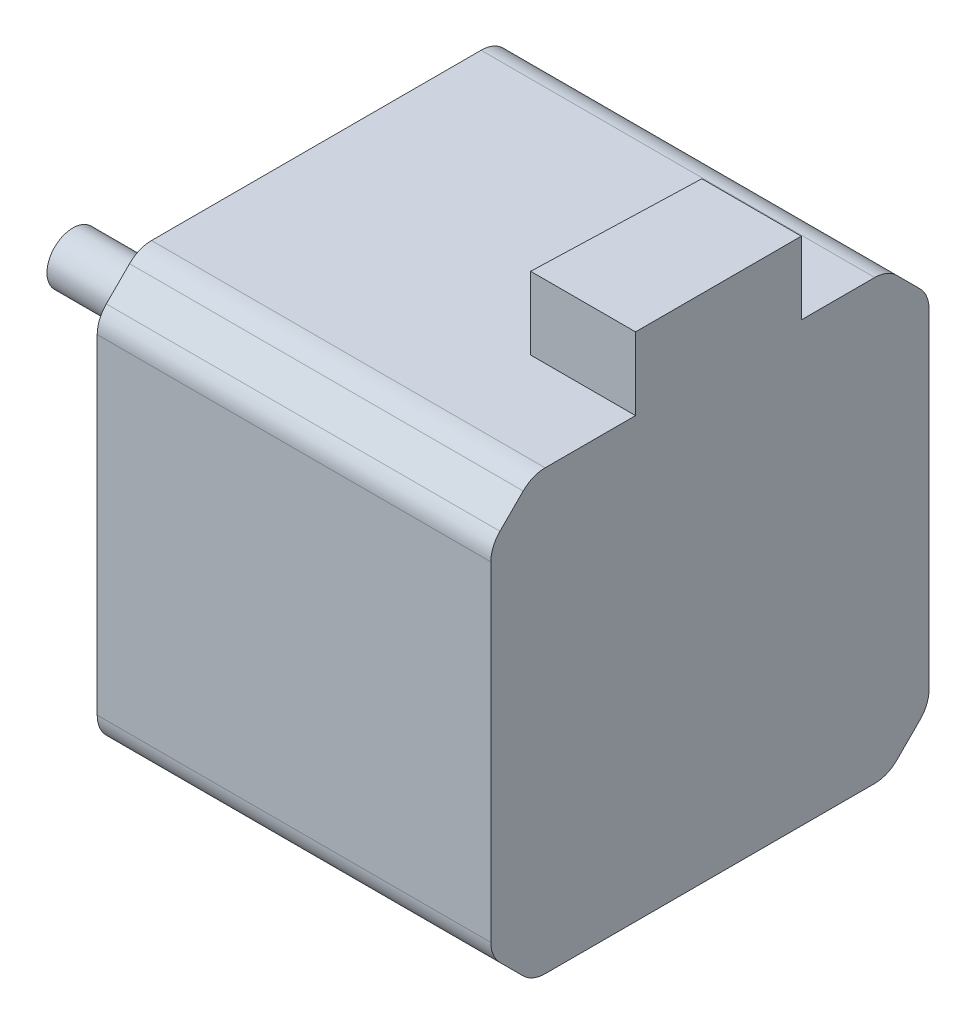
ISO-10303-21;
HEADER;
FILE_DESCRIPTION(('STEP AP214'),'2;1');
FILE_NAME('part.step','',(''),(''),'','','');
FILE_SCHEMA(('AUTOMOTIVE_DESIGN { 1 0 10303 214 1 1 1 1 }'));
ENDSEC;
DATA;
#1=APPLICATION_CONTEXT('core data for automotive mechanical design processes');
#2=APPLICATION_PROTOCOL_DEFINITION('international standard','automotive_design',2000,#1);
#3=PRODUCT_CONTEXT('',#1,'mechanical');
#4=PRODUCT('Part','Part','',(#3));
#5=PRODUCT_RELATED_PRODUCT_CATEGORY('part','',(#4));
#6=PRODUCT_DEFINITION_FORMATION('','',#4);
#7=PRODUCT_DEFINITION_CONTEXT('part definition',#1,'design');
#8=PRODUCT_DEFINITION('design','',#6,#7);
#9=PRODUCT_DEFINITION_SHAPE('','',#8);
#10=(LENGTH_UNIT() NAMED_UNIT(*) SI_UNIT(.MILLI.,.METRE.));
#11=(NAMED_UNIT(*) PLANE_ANGLE_UNIT() SI_UNIT($,.RADIAN.));
#12=(NAMED_UNIT(*) SI_UNIT($,.STERADIAN.) SOLID_ANGLE_UNIT());
#13=UNCERTAINTY_MEASURE_WITH_UNIT(LENGTH_MEASURE(1.E-05),#10,'distance_accuracy_value','');
#14=(GEOMETRIC_REPRESENTATION_CONTEXT(3) GLOBAL_UNCERTAINTY_ASSIGNED_CONTEXT((#13)) GLOBAL_UNIT_ASSIGNED_CONTEXT((#10,
#11,#12)) REPRESENTATION_CONTEXT('',''));
#15=CARTESIAN_POINT('',(0.,0.,0.));
#16=DIRECTION('',(0.,0.,1.));
#17=DIRECTION('',(1.,0.,0.));
#18=AXIS2_PLACEMENT_3D('',#15,#16,#17);
#19=CARTESIAN_POINT('',(38.,42.3,-5.2426406871193));
#20=DIRECTION('',(0.,1.,0.));
#21=DIRECTION('',(0.,0.,1.));
#22=AXIS2_PLACEMENT_3D('',#19,#20,#21);
#23=PLANE('',#22);
#24=DIRECTION('',(-0.032942464499696,0.,0.999457249727414));
#25=VECTOR('',#24,1.);
#26=CARTESIAN_POINT('',(28.4,42.3,-29.967521896495));
#27=LINE('',#26,#25);
#28=CARTESIAN_POINT('',(28.4,42.3,-29.967521896495));
#29=VERTEX_POINT('',#28);
#30=CARTESIAN_POINT('',(27.8726343401492,42.3,-13.967521896495));
#31=VERTEX_POINT('',#30);
#32=EDGE_CURVE('E49',#29,#31,#27,.T.);
#33=ORIENTED_EDGE('',*,*,#32,.F.);
#34=DIRECTION('',(-1.,0.,0.));
#35=VECTOR('',#34,1.);
#36=CARTESIAN_POINT('',(28.4,42.3,-29.967521896495));
#37=LINE('',#36,#35);
#38=CARTESIAN_POINT('',(38.,42.3,-29.967521896495));
#39=VERTEX_POINT('',#38);
#40=EDGE_CURVE('E706',#39,#29,#37,.T.);
#41=ORIENTED_EDGE('',*,*,#40,.F.);
#42=DIRECTION('',(0.,0.,-1.));
#43=VECTOR('',#42,1.);
#44=CARTESIAN_POINT('',(38.,42.3,-5.2426406871193));
#45=LINE('',#44,#43);
#46=CARTESIAN_POINT('',(38.,42.3,-37.0573593128807));
#47=VERTEX_POINT('',#46);
#48=EDGE_CURVE('E193',#39,#47,#45,.T.);
#49=ORIENTED_EDGE('',*,*,#48,.T.);
#50=DIRECTION('',(-1.,0.,0.));
#51=VECTOR('',#50,1.);
#52=CARTESIAN_POINT('',(38.,42.3,-37.0573593128807));
#53=LINE('',#52,#51);
#54=CARTESIAN_POINT('',(0.,42.3,-37.0573593128807));
#55=VERTEX_POINT('',#54);
#56=EDGE_CURVE('E348',#47,#55,#53,.T.);
#57=ORIENTED_EDGE('',*,*,#56,.T.);
#58=DIRECTION('',(0.,0.,-1.));
#59=VECTOR('',#58,1.);
#60=CARTESIAN_POINT('',(0.,42.3,-5.2426406871193));
#61=LINE('',#60,#59);
#62=CARTESIAN_POINT('',(0.,42.3,-5.2426406871193));
#63=VERTEX_POINT('',#62);
#64=EDGE_CURVE('E276',#63,#55,#61,.T.);
#65=ORIENTED_EDGE('',*,*,#64,.F.);
#66=DIRECTION('',(-1.,0.,0.));
#67=VECTOR('',#66,1.);
#68=CARTESIAN_POINT('',(38.,42.3,-5.2426406871193));
#69=LINE('',#68,#67);
#70=CARTESIAN_POINT('',(38.,42.3,-5.2426406871193));
#71=VERTEX_POINT('',#70);
#72=EDGE_CURVE('E273',#71,#63,#69,.T.);
#73=ORIENTED_EDGE('',*,*,#72,.F.);
#74=CARTESIAN_POINT('',(38.,42.3,-13.967521896495));
#75=VERTEX_POINT('',#74);
#76=EDGE_CURVE('E237',#71,#75,#45,.T.);
#77=ORIENTED_EDGE('',*,*,#76,.T.);
#78=DIRECTION('',(1.,0.,0.));
#79=VECTOR('',#78,1.);
#80=CARTESIAN_POINT('',(38.,42.3,-13.967521896495));
#81=LINE('',#80,#79);
#82=EDGE_CURVE('E54',#31,#75,#81,.T.);
#83=ORIENTED_EDGE('',*,*,#82,.F.);
#84=EDGE_LOOP('',(#33,#41,#49,#57,#65,#73,#77,#83));
#85=FACE_BOUND('',#84,.T.);
#86=ADVANCED_FACE('F34',(#85),#23,.T.);
#87=CARTESIAN_POINT('',(38.,39.3,-5.24264068711928));
#88=DIRECTION('',(-1.,0.,0.));
#89=DIRECTION('',(0.,0.,1.));
#90=AXIS2_PLACEMENT_3D('',#87,#88,#89);
#91=CYLINDRICAL_SURFACE('',#90,3.);
#92=CARTESIAN_POINT('',(0.,39.3,-5.24264068711928));
#93=DIRECTION('',(-1.,0.,0.));
#94=DIRECTION('',(0.,0.,1.));
#95=AXIS2_PLACEMENT_3D('',#92,#93,#94);
#96=CIRCLE('',#95,3.);
#97=CARTESIAN_POINT('',(0.,41.4213203435596,-3.12132034355963));
#98=VERTEX_POINT('',#97);
#99=EDGE_CURVE('E232',#98,#63,#96,.T.);
#100=ORIENTED_EDGE('',*,*,#99,.F.);
#101=DIRECTION('',(-1.,0.,0.));
#102=VECTOR('',#101,1.);
#103=CARTESIAN_POINT('',(38.,41.4213203435596,-3.12132034355963));
#104=LINE('',#103,#102);
#105=CARTESIAN_POINT('',(38.,41.4213203435596,-3.12132034355963));
#106=VERTEX_POINT('',#105);
#107=EDGE_CURVE('E316',#106,#98,#104,.T.);
#108=ORIENTED_EDGE('',*,*,#107,.F.);
#109=CARTESIAN_POINT('',(38.,39.3,-5.24264068711928));
#110=DIRECTION('',(-1.,0.,0.));
#111=DIRECTION('',(0.,0.,1.));
#112=AXIS2_PLACEMENT_3D('',#109,#110,#111);
#113=CIRCLE('',#112,3.);
#114=EDGE_CURVE('E233',#106,#71,#113,.T.);
#115=ORIENTED_EDGE('',*,*,#114,.T.);
#116=ORIENTED_EDGE('',*,*,#72,.T.);
#117=EDGE_LOOP('',(#100,#108,#115,#116));
#118=FACE_BOUND('',#117,.T.);
#119=ADVANCED_FACE('F370',(#118),#91,.T.);
#120=CARTESIAN_POINT('',(38.,39.1786796564404,-0.878679656440368));
#121=DIRECTION('',(0.,0.707106781186548,0.707106781186547));
#122=DIRECTION('',(0.,-0.707106781186547,0.707106781186548));
#123=AXIS2_PLACEMENT_3D('',#120,#121,#122);
#124=PLANE('',#123);
#125=DIRECTION('',(0.,0.707106781186547,-0.707106781186548));
#126=VECTOR('',#125,1.);
#127=CARTESIAN_POINT('',(0.,39.1786796564404,-0.878679656440368));
#128=LINE('',#127,#126);
#129=CARTESIAN_POINT('',(0.,39.1786796564404,-0.878679656440369));
#130=VERTEX_POINT('',#129);
#131=EDGE_CURVE('E236',#130,#98,#128,.T.);
#132=ORIENTED_EDGE('',*,*,#131,.F.);
#133=DIRECTION('',(-1.,0.,0.));
#134=VECTOR('',#133,1.);
#135=CARTESIAN_POINT('',(38.,39.1786796564404,-0.878679656440369));
#136=LINE('',#135,#134);
#137=CARTESIAN_POINT('',(38.,39.1786796564404,-0.878679656440369));
#138=VERTEX_POINT('',#137);
#139=EDGE_CURVE('E318',#138,#130,#136,.T.);
#140=ORIENTED_EDGE('',*,*,#139,.F.);
#141=DIRECTION('',(0.,0.707106781186547,-0.707106781186548));
#142=VECTOR('',#141,1.);
#143=CARTESIAN_POINT('',(38.,39.1786796564404,-0.878679656440368));
#144=LINE('',#143,#142);
#145=EDGE_CURVE('E270',#138,#106,#144,.T.);
#146=ORIENTED_EDGE('',*,*,#145,.T.);
#147=ORIENTED_EDGE('',*,*,#107,.T.);
#148=EDGE_LOOP('',(#132,#140,#146,#147));
#149=FACE_BOUND('',#148,.T.);
#150=ADVANCED_FACE('F375',(#149),#124,.T.);
#151=CARTESIAN_POINT('',(38.,37.0573593128807,-3.));
#152=DIRECTION('',(-1.,0.,0.));
#153=DIRECTION('',(0.,0.,1.));
#154=AXIS2_PLACEMENT_3D('',#151,#152,#153);
#155=CYLINDRICAL_SURFACE('',#154,3.);
#156=CARTESIAN_POINT('',(0.,37.0573593128807,-3.));
#157=DIRECTION('',(1.,0.,0.));
#158=DIRECTION('',(0.,0.,-1.));
#159=AXIS2_PLACEMENT_3D('',#156,#157,#158);
#160=CIRCLE('',#159,3.);
#161=CARTESIAN_POINT('',(0.,37.0573593128807,0.));
#162=VERTEX_POINT('',#161);
#163=EDGE_CURVE('E311',#130,#162,#160,.T.);
#164=ORIENTED_EDGE('',*,*,#163,.T.);
#165=DIRECTION('',(-1.,0.,0.));
#166=VECTOR('',#165,1.);
#167=CARTESIAN_POINT('',(38.,37.0573593128807,0.));
#168=LINE('',#167,#166);
#169=CARTESIAN_POINT('',(38.,37.0573593128807,0.));
#170=VERTEX_POINT('',#169);
#171=EDGE_CURVE('E320',#170,#162,#168,.T.);
#172=ORIENTED_EDGE('',*,*,#171,.F.);
#173=CARTESIAN_POINT('',(38.,37.0573593128807,-3.));
#174=DIRECTION('',(1.,0.,0.));
#175=DIRECTION('',(0.,0.,-1.));
#176=AXIS2_PLACEMENT_3D('',#173,#174,#175);
#177=CIRCLE('',#176,3.);
#178=EDGE_CURVE('E268',#138,#170,#177,.T.);
#179=ORIENTED_EDGE('',*,*,#178,.F.);
#180=ORIENTED_EDGE('',*,*,#139,.T.);
#181=EDGE_LOOP('',(#164,#172,#179,#180));
#182=FACE_BOUND('',#181,.T.);
#183=ADVANCED_FACE('F425',(#182),#155,.T.);
#184=CARTESIAN_POINT('',(38.,5.2426406871193,0.));
#185=DIRECTION('',(0.,0.,1.));
#186=DIRECTION('',(1.,0.,0.));
#187=AXIS2_PLACEMENT_3D('',#184,#185,#186);
#188=PLANE('',#187);
#189=DIRECTION('',(0.,1.,0.));
#190=VECTOR('',#189,1.);
#191=CARTESIAN_POINT('',(0.,5.2426406871193,0.));
#192=LINE('',#191,#190);
#193=CARTESIAN_POINT('',(0.,5.24264068711928,0.));
#194=VERTEX_POINT('',#193);
#195=EDGE_CURVE('E308',#194,#162,#192,.T.);
#196=ORIENTED_EDGE('',*,*,#195,.F.);
#197=DIRECTION('',(-1.,0.,0.));
#198=VECTOR('',#197,1.);
#199=CARTESIAN_POINT('',(38.,5.24264068711928,0.));
#200=LINE('',#199,#198);
#201=CARTESIAN_POINT('',(38.,5.24264068711928,0.));
#202=VERTEX_POINT('',#201);
#203=EDGE_CURVE('E322',#202,#194,#200,.T.);
#204=ORIENTED_EDGE('',*,*,#203,.F.);
#205=DIRECTION('',(0.,1.,0.));
#206=VECTOR('',#205,1.);
#207=CARTESIAN_POINT('',(38.,5.2426406871193,0.));
#208=LINE('',#207,#206);
#209=EDGE_CURVE('E265',#202,#170,#208,.T.);
#210=ORIENTED_EDGE('',*,*,#209,.T.);
#211=ORIENTED_EDGE('',*,*,#171,.T.);
#212=EDGE_LOOP('',(#196,#204,#210,#211));
#213=FACE_BOUND('',#212,.T.);
#214=ADVANCED_FACE('F421',(#213),#188,.T.);
#215=CARTESIAN_POINT('',(38.,5.24264068711928,-3.));
#216=DIRECTION('',(-1.,0.,0.));
#217=DIRECTION('',(0.,0.,1.));
#218=AXIS2_PLACEMENT_3D('',#215,#216,#217);
#219=CYLINDRICAL_SURFACE('',#218,3.);
#220=CARTESIAN_POINT('',(0.,5.24264068711928,-3.));
#221=DIRECTION('',(-1.,0.,0.));
#222=DIRECTION('',(0.,0.,1.));
#223=AXIS2_PLACEMENT_3D('',#220,#221,#222);
#224=CIRCLE('',#223,3.);
#225=CARTESIAN_POINT('',(0.,3.12132034355963,-0.878679656440366));
#226=VERTEX_POINT('',#225);
#227=EDGE_CURVE('E305',#226,#194,#224,.T.);
#228=ORIENTED_EDGE('',*,*,#227,.F.);
#229=DIRECTION('',(-1.,0.,0.));
#230=VECTOR('',#229,1.);
#231=CARTESIAN_POINT('',(38.,3.12132034355963,-0.878679656440366));
#232=LINE('',#231,#230);
#233=CARTESIAN_POINT('',(38.,3.12132034355963,-0.878679656440366));
#234=VERTEX_POINT('',#233);
#235=EDGE_CURVE('E324',#234,#226,#232,.T.);
#236=ORIENTED_EDGE('',*,*,#235,.F.);
#237=CARTESIAN_POINT('',(38.,5.24264068711928,-3.));
#238=DIRECTION('',(-1.,0.,0.));
#239=DIRECTION('',(0.,0.,1.));
#240=AXIS2_PLACEMENT_3D('',#237,#238,#239);
#241=CIRCLE('',#240,3.);
#242=EDGE_CURVE('E262',#234,#202,#241,.T.);
#243=ORIENTED_EDGE('',*,*,#242,.T.);
#244=ORIENTED_EDGE('',*,*,#203,.T.);
#245=EDGE_LOOP('',(#228,#236,#243,#244));
#246=FACE_BOUND('',#245,.T.);
#247=ADVANCED_FACE('F417',(#246),#219,.T.);
#248=CARTESIAN_POINT('',(38.,3.12132034355963,-0.878679656440366));
#249=DIRECTION('',(0.,0.707106781186548,-0.707106781186548));
#250=DIRECTION('',(0.,0.707106781186548,0.707106781186548));
#251=AXIS2_PLACEMENT_3D('',#248,#249,#250);
#252=PLANE('',#251);
#253=DIRECTION('',(0.,-0.707106781186547,-0.707106781186547));
#254=VECTOR('',#253,1.);
#255=CARTESIAN_POINT('',(0.,3.12132034355963,-0.878679656440366));
#256=LINE('',#255,#254);
#257=CARTESIAN_POINT('',(0.,0.878679656440366,-3.12132034355963));
#258=VERTEX_POINT('',#257);
#259=EDGE_CURVE('E303',#226,#258,#256,.T.);
#260=ORIENTED_EDGE('',*,*,#259,.T.);
#261=DIRECTION('',(-1.,0.,0.));
#262=VECTOR('',#261,1.);
#263=CARTESIAN_POINT('',(38.,0.878679656440366,-3.12132034355963));
#264=LINE('',#263,#262);
#265=CARTESIAN_POINT('',(38.,0.878679656440366,-3.12132034355963));
#266=VERTEX_POINT('',#265);
#267=EDGE_CURVE('E326',#266,#258,#264,.T.);
#268=ORIENTED_EDGE('',*,*,#267,.F.);
#269=DIRECTION('',(0.,-0.707106781186547,-0.707106781186547));
#270=VECTOR('',#269,1.);
#271=CARTESIAN_POINT('',(38.,3.12132034355963,-0.878679656440366));
#272=LINE('',#271,#270);
#273=EDGE_CURVE('E260',#234,#266,#272,.T.);
#274=ORIENTED_EDGE('',*,*,#273,.F.);
#275=ORIENTED_EDGE('',*,*,#235,.T.);
#276=EDGE_LOOP('',(#260,#268,#274,#275));
#277=FACE_BOUND('',#276,.T.);
#278=ADVANCED_FACE('F413',(#277),#252,.F.);
#279=CARTESIAN_POINT('',(38.,3.,-5.24264068711928));
#280=DIRECTION('',(-1.,0.,0.));
#281=DIRECTION('',(0.,0.,1.));
#282=AXIS2_PLACEMENT_3D('',#279,#280,#281);
#283=CYLINDRICAL_SURFACE('',#282,3.);
#284=CARTESIAN_POINT('',(0.,3.,-5.24264068711928));
#285=DIRECTION('',(1.,0.,0.));
#286=DIRECTION('',(0.,0.,-1.));
#287=AXIS2_PLACEMENT_3D('',#284,#285,#286);
#288=CIRCLE('',#287,3.);
#289=CARTESIAN_POINT('',(0.,0.,-5.2426406871193));
#290=VERTEX_POINT('',#289);
#291=EDGE_CURVE('E301',#258,#290,#288,.T.);
#292=ORIENTED_EDGE('',*,*,#291,.T.);
#293=DIRECTION('',(-1.,0.,0.));
#294=VECTOR('',#293,1.);
#295=CARTESIAN_POINT('',(38.,0.,-5.2426406871193));
#296=LINE('',#295,#294);
#297=CARTESIAN_POINT('',(38.,0.,-5.2426406871193));
#298=VERTEX_POINT('',#297);
#299=EDGE_CURVE('E329',#298,#290,#296,.T.);
#300=ORIENTED_EDGE('',*,*,#299,.F.);
#301=CARTESIAN_POINT('',(38.,3.,-5.24264068711928));
#302=DIRECTION('',(1.,0.,0.));
#303=DIRECTION('',(0.,0.,-1.));
#304=AXIS2_PLACEMENT_3D('',#301,#302,#303);
#305=CIRCLE('',#304,3.);
#306=EDGE_CURVE('E258',#266,#298,#305,.T.);
#307=ORIENTED_EDGE('',*,*,#306,.F.);
#308=ORIENTED_EDGE('',*,*,#267,.T.);
#309=EDGE_LOOP('',(#292,#300,#307,#308));
#310=FACE_BOUND('',#309,.T.);
#311=ADVANCED_FACE('F409',(#310),#283,.T.);
#312=CARTESIAN_POINT('',(38.,0.,-5.2426406871193));
#313=DIRECTION('',(0.,1.,0.));
#314=DIRECTION('',(0.,0.,1.));
#315=AXIS2_PLACEMENT_3D('',#312,#313,#314);
#316=PLANE('',#315);
#317=DIRECTION('',(0.,0.,-1.));
#318=VECTOR('',#317,1.);
#319=CARTESIAN_POINT('',(0.,0.,-5.2426406871193));
#320=LINE('',#319,#318);
#321=CARTESIAN_POINT('',(0.,0.,-37.0573593128807));
#322=VERTEX_POINT('',#321);
#323=EDGE_CURVE('E298',#290,#322,#320,.T.);
#324=ORIENTED_EDGE('',*,*,#323,.T.);
#325=DIRECTION('',(-1.,0.,0.));
#326=VECTOR('',#325,1.);
#327=CARTESIAN_POINT('',(38.,0.,-37.0573593128807));
#328=LINE('',#327,#326);
#329=CARTESIAN_POINT('',(38.,0.,-37.0573593128807));
#330=VERTEX_POINT('',#329);
#331=EDGE_CURVE('E332',#330,#322,#328,.T.);
#332=ORIENTED_EDGE('',*,*,#331,.F.);
#333=DIRECTION('',(0.,0.,-1.));
#334=VECTOR('',#333,1.);
#335=CARTESIAN_POINT('',(38.,0.,-5.2426406871193));
#336=LINE('',#335,#334);
#337=EDGE_CURVE('E256',#298,#330,#336,.T.);
#338=ORIENTED_EDGE('',*,*,#337,.F.);
#339=ORIENTED_EDGE('',*,*,#299,.T.);
#340=EDGE_LOOP('',(#324,#332,#338,#339));
#341=FACE_BOUND('',#340,.T.);
#342=ADVANCED_FACE('F405',(#341),#316,.F.);
#343=CARTESIAN_POINT('',(38.,3.,-37.0573593128807));
#344=DIRECTION('',(-1.,0.,0.));
#345=DIRECTION('',(0.,0.,1.));
#346=AXIS2_PLACEMENT_3D('',#343,#344,#345);
#347=CYLINDRICAL_SURFACE('',#346,3.);
#348=CARTESIAN_POINT('',(0.,3.,-37.0573593128807));
#349=DIRECTION('',(-1.,0.,0.));
#350=DIRECTION('',(0.,0.,1.));
#351=AXIS2_PLACEMENT_3D('',#348,#349,#350);
#352=CIRCLE('',#351,3.);
#353=CARTESIAN_POINT('',(0.,0.878679656440368,-39.1786796564404));
#354=VERTEX_POINT('',#353);
#355=EDGE_CURVE('E295',#354,#322,#352,.T.);
#356=ORIENTED_EDGE('',*,*,#355,.F.);
#357=DIRECTION('',(-1.,0.,0.));
#358=VECTOR('',#357,1.);
#359=CARTESIAN_POINT('',(38.,0.878679656440368,-39.1786796564404));
#360=LINE('',#359,#358);
#361=CARTESIAN_POINT('',(38.,0.878679656440368,-39.1786796564404));
#362=VERTEX_POINT('',#361);
#363=EDGE_CURVE('E334',#362,#354,#360,.T.);
#364=ORIENTED_EDGE('',*,*,#363,.F.);
#365=CARTESIAN_POINT('',(38.,3.,-37.0573593128807));
#366=DIRECTION('',(-1.,0.,0.));
#367=DIRECTION('',(0.,0.,1.));
#368=AXIS2_PLACEMENT_3D('',#365,#366,#367);
#369=CIRCLE('',#368,3.);
#370=EDGE_CURVE('E253',#362,#330,#369,.T.);
#371=ORIENTED_EDGE('',*,*,#370,.T.);
#372=ORIENTED_EDGE('',*,*,#331,.T.);
#373=EDGE_LOOP('',(#356,#364,#371,#372));
#374=FACE_BOUND('',#373,.T.);
#375=ADVANCED_FACE('F401',(#374),#347,.T.);
#376=CARTESIAN_POINT('',(38.,0.878679656440368,-39.1786796564404));
#377=DIRECTION('',(0.,0.707106781186547,0.707106781186548));
#378=DIRECTION('',(0.,-0.707106781186548,0.707106781186547));
#379=AXIS2_PLACEMENT_3D('',#376,#377,#378);
#380=PLANE('',#379);
#381=DIRECTION('',(0.,0.707106781186548,-0.707106781186547));
#382=VECTOR('',#381,1.);
#383=CARTESIAN_POINT('',(0.,0.878679656440368,-39.1786796564404));
#384=LINE('',#383,#382);
#385=CARTESIAN_POINT('',(0.,3.12132034355963,-41.4213203435596));
#386=VERTEX_POINT('',#385);
#387=EDGE_CURVE('E293',#354,#386,#384,.T.);
#388=ORIENTED_EDGE('',*,*,#387,.T.);
#389=DIRECTION('',(-1.,0.,0.));
#390=VECTOR('',#389,1.);
#391=CARTESIAN_POINT('',(38.,3.12132034355963,-41.4213203435596));
#392=LINE('',#391,#390);
#393=CARTESIAN_POINT('',(38.,3.12132034355963,-41.4213203435596));
#394=VERTEX_POINT('',#393);
#395=EDGE_CURVE('E336',#394,#386,#392,.T.);
#396=ORIENTED_EDGE('',*,*,#395,.F.);
#397=DIRECTION('',(0.,0.707106781186548,-0.707106781186547));
#398=VECTOR('',#397,1.);
#399=CARTESIAN_POINT('',(38.,0.878679656440368,-39.1786796564404));
#400=LINE('',#399,#398);
#401=EDGE_CURVE('E251',#362,#394,#400,.T.);
#402=ORIENTED_EDGE('',*,*,#401,.F.);
#403=ORIENTED_EDGE('',*,*,#363,.T.);
#404=EDGE_LOOP('',(#388,#396,#402,#403));
#405=FACE_BOUND('',#404,.T.);
#406=ADVANCED_FACE('F397',(#405),#380,.F.);
#407=CARTESIAN_POINT('',(38.,5.24264068711928,-39.3));
#408=DIRECTION('',(-1.,0.,0.));
#409=DIRECTION('',(0.,0.,1.));
#410=AXIS2_PLACEMENT_3D('',#407,#408,#409);
#411=CYLINDRICAL_SURFACE('',#410,3.);
#412=CARTESIAN_POINT('',(0.,5.24264068711928,-39.3));
#413=DIRECTION('',(1.,0.,0.));
#414=DIRECTION('',(0.,0.,-1.));
#415=AXIS2_PLACEMENT_3D('',#412,#413,#414);
#416=CIRCLE('',#415,3.);
#417=CARTESIAN_POINT('',(0.,5.2426406871193,-42.3));
#418=VERTEX_POINT('',#417);
#419=EDGE_CURVE('E291',#386,#418,#416,.T.);
#420=ORIENTED_EDGE('',*,*,#419,.T.);
#421=DIRECTION('',(-1.,0.,0.));
#422=VECTOR('',#421,1.);
#423=CARTESIAN_POINT('',(38.,5.2426406871193,-42.3));
#424=LINE('',#423,#422);
#425=CARTESIAN_POINT('',(38.,5.2426406871193,-42.3));
#426=VERTEX_POINT('',#425);
#427=EDGE_CURVE('E339',#426,#418,#424,.T.);
#428=ORIENTED_EDGE('',*,*,#427,.F.);
#429=CARTESIAN_POINT('',(38.,5.24264068711928,-39.3));
#430=DIRECTION('',(1.,0.,0.));
#431=DIRECTION('',(0.,0.,-1.));
#432=AXIS2_PLACEMENT_3D('',#429,#430,#431);
#433=CIRCLE('',#432,3.);
#434=EDGE_CURVE('E249',#394,#426,#433,.T.);
#435=ORIENTED_EDGE('',*,*,#434,.F.);
#436=ORIENTED_EDGE('',*,*,#395,.T.);
#437=EDGE_LOOP('',(#420,#428,#435,#436));
#438=FACE_BOUND('',#437,.T.);
#439=ADVANCED_FACE('F393',(#438),#411,.T.);
#440=CARTESIAN_POINT('',(38.,5.2426406871193,-42.3));
#441=DIRECTION('',(0.,0.,1.));
#442=DIRECTION('',(1.,0.,0.));
#443=AXIS2_PLACEMENT_3D('',#440,#441,#442);
#444=PLANE('',#443);
#445=DIRECTION('',(0.,1.,0.));
#446=VECTOR('',#445,1.);
#447=CARTESIAN_POINT('',(0.,5.2426406871193,-42.3));
#448=LINE('',#447,#446);
#449=CARTESIAN_POINT('',(0.,37.0573593128807,-42.3));
#450=VERTEX_POINT('',#449);
#451=EDGE_CURVE('E288',#418,#450,#448,.T.);
#452=ORIENTED_EDGE('',*,*,#451,.T.);
#453=DIRECTION('',(-1.,0.,0.));
#454=VECTOR('',#453,1.);
#455=CARTESIAN_POINT('',(38.,37.0573593128807,-42.3));
#456=LINE('',#455,#454);
#457=CARTESIAN_POINT('',(38.,37.0573593128807,-42.3));
#458=VERTEX_POINT('',#457);
#459=EDGE_CURVE('E342',#458,#450,#456,.T.);
#460=ORIENTED_EDGE('',*,*,#459,.F.);
#461=DIRECTION('',(0.,1.,0.));
#462=VECTOR('',#461,1.);
#463=CARTESIAN_POINT('',(38.,5.2426406871193,-42.3));
#464=LINE('',#463,#462);
#465=EDGE_CURVE('E247',#426,#458,#464,.T.);
#466=ORIENTED_EDGE('',*,*,#465,.F.);
#467=ORIENTED_EDGE('',*,*,#427,.T.);
#468=EDGE_LOOP('',(#452,#460,#466,#467));
#469=FACE_BOUND('',#468,.T.);
#470=ADVANCED_FACE('F389',(#469),#444,.F.);
#471=CARTESIAN_POINT('',(38.,37.0573593128807,-39.3));
#472=DIRECTION('',(-1.,0.,0.));
#473=DIRECTION('',(0.,0.,1.));
#474=AXIS2_PLACEMENT_3D('',#471,#472,#473);
#475=CYLINDRICAL_SURFACE('',#474,3.);
#476=CARTESIAN_POINT('',(0.,37.0573593128807,-39.3));
#477=DIRECTION('',(-1.,0.,0.));
#478=DIRECTION('',(0.,0.,1.));
#479=AXIS2_PLACEMENT_3D('',#476,#477,#478);
#480=CIRCLE('',#479,3.);
#481=CARTESIAN_POINT('',(0.,39.1786796564404,-41.4213203435596));
#482=VERTEX_POINT('',#481);
#483=EDGE_CURVE('E285',#482,#450,#480,.T.);
#484=ORIENTED_EDGE('',*,*,#483,.F.);
#485=DIRECTION('',(-1.,0.,0.));
#486=VECTOR('',#485,1.);
#487=CARTESIAN_POINT('',(38.,39.1786796564404,-41.4213203435596));
#488=LINE('',#487,#486);
#489=CARTESIAN_POINT('',(38.,39.1786796564404,-41.4213203435596));
#490=VERTEX_POINT('',#489);
#491=EDGE_CURVE('E344',#490,#482,#488,.T.);
#492=ORIENTED_EDGE('',*,*,#491,.F.);
#493=CARTESIAN_POINT('',(38.,37.0573593128807,-39.3));
#494=DIRECTION('',(-1.,0.,0.));
#495=DIRECTION('',(0.,0.,1.));
#496=AXIS2_PLACEMENT_3D('',#493,#494,#495);
#497=CIRCLE('',#496,3.);
#498=EDGE_CURVE('E244',#490,#458,#497,.T.);
#499=ORIENTED_EDGE('',*,*,#498,.T.);
#500=ORIENTED_EDGE('',*,*,#459,.T.);
#501=EDGE_LOOP('',(#484,#492,#499,#500));
#502=FACE_BOUND('',#501,.T.);
#503=ADVANCED_FACE('F385',(#502),#475,.T.);
#504=CARTESIAN_POINT('',(38.,41.4213203435596,-39.1786796564404));
#505=DIRECTION('',(0.,0.707106781186548,-0.707106781186548));
#506=DIRECTION('',(0.,0.707106781186548,0.707106781186548));
#507=AXIS2_PLACEMENT_3D('',#504,#505,#506);
#508=PLANE('',#507);
#509=DIRECTION('',(0.,-0.707106781186547,-0.707106781186547));
#510=VECTOR('',#509,1.);
#511=CARTESIAN_POINT('',(0.,41.4213203435596,-39.1786796564404));
#512=LINE('',#511,#510);
#513=CARTESIAN_POINT('',(0.,41.4213203435596,-39.1786796564404));
#514=VERTEX_POINT('',#513);
#515=EDGE_CURVE('E282',#514,#482,#512,.T.);
#516=ORIENTED_EDGE('',*,*,#515,.F.);
#517=DIRECTION('',(-1.,0.,0.));
#518=VECTOR('',#517,1.);
#519=CARTESIAN_POINT('',(38.,41.4213203435596,-39.1786796564404));
#520=LINE('',#519,#518);
#521=CARTESIAN_POINT('',(38.,41.4213203435596,-39.1786796564404));
#522=VERTEX_POINT('',#521);
#523=EDGE_CURVE('E346',#522,#514,#520,.T.);
#524=ORIENTED_EDGE('',*,*,#523,.F.);
#525=DIRECTION('',(0.,-0.707106781186547,-0.707106781186547));
#526=VECTOR('',#525,1.);
#527=CARTESIAN_POINT('',(38.,41.4213203435596,-39.1786796564404));
#528=LINE('',#527,#526);
#529=EDGE_CURVE('E241',#522,#490,#528,.T.);
#530=ORIENTED_EDGE('',*,*,#529,.T.);
#531=ORIENTED_EDGE('',*,*,#491,.T.);
#532=EDGE_LOOP('',(#516,#524,#530,#531));
#533=FACE_BOUND('',#532,.T.);
#534=ADVANCED_FACE('F381',(#533),#508,.T.);
#535=CARTESIAN_POINT('',(38.,39.3,-37.0573593128807));
#536=DIRECTION('',(-1.,0.,0.));
#537=DIRECTION('',(0.,0.,1.));
#538=AXIS2_PLACEMENT_3D('',#535,#536,#537);
#539=CYLINDRICAL_SURFACE('',#538,3.);
#540=CARTESIAN_POINT('',(0.,39.3,-37.0573593128807));
#541=DIRECTION('',(1.,0.,0.));
#542=DIRECTION('',(0.,0.,-1.));
#543=AXIS2_PLACEMENT_3D('',#540,#541,#542);
#544=CIRCLE('',#543,3.);
#545=EDGE_CURVE('E279',#514,#55,#544,.T.);
#546=ORIENTED_EDGE('',*,*,#545,.T.);
#547=ORIENTED_EDGE('',*,*,#56,.F.);
#548=CARTESIAN_POINT('',(38.,39.3,-37.0573593128807));
#549=DIRECTION('',(1.,0.,0.));
#550=DIRECTION('',(0.,0.,-1.));
#551=AXIS2_PLACEMENT_3D('',#548,#549,#550);
#552=CIRCLE('',#551,3.);
#553=EDGE_CURVE('E239',#522,#47,#552,.T.);
#554=ORIENTED_EDGE('',*,*,#553,.F.);
#555=ORIENTED_EDGE('',*,*,#523,.T.);
#556=EDGE_LOOP('',(#546,#547,#554,#555));
#557=FACE_BOUND('',#556,.T.);
#558=ADVANCED_FACE('F378',(#557),#539,.T.);
#559=CARTESIAN_POINT('',(38.,39.3,-5.24264068711928));
#560=DIRECTION('',(-1.,0.,0.));
#561=DIRECTION('',(0.,0.,1.));
#562=AXIS2_PLACEMENT_3D('',#559,#560,#561);
#563=PLANE('',#562);
#564=ORIENTED_EDGE('',*,*,#114,.F.);
#565=ORIENTED_EDGE('',*,*,#145,.F.);
#566=ORIENTED_EDGE('',*,*,#178,.T.);
#567=ORIENTED_EDGE('',*,*,#209,.F.);
#568=ORIENTED_EDGE('',*,*,#242,.F.);
#569=ORIENTED_EDGE('',*,*,#273,.T.);
#570=ORIENTED_EDGE('',*,*,#306,.T.);
#571=ORIENTED_EDGE('',*,*,#337,.T.);
#572=ORIENTED_EDGE('',*,*,#370,.F.);
#573=ORIENTED_EDGE('',*,*,#401,.T.);
#574=ORIENTED_EDGE('',*,*,#434,.T.);
#575=ORIENTED_EDGE('',*,*,#465,.T.);
#576=ORIENTED_EDGE('',*,*,#498,.F.);
#577=ORIENTED_EDGE('',*,*,#529,.F.);
#578=ORIENTED_EDGE('',*,*,#553,.T.);
#579=ORIENTED_EDGE('',*,*,#48,.F.);
#580=DIRECTION('',(0.,-1.,0.));
#581=VECTOR('',#580,1.);
#582=CARTESIAN_POINT('',(38.,49.3,-29.967521896495));
#583=LINE('',#582,#581);
#584=CARTESIAN_POINT('',(38.,49.3,-29.967521896495));
#585=VERTEX_POINT('',#584);
#586=EDGE_CURVE('E174',#585,#39,#583,.T.);
#587=ORIENTED_EDGE('',*,*,#586,.F.);
#588=DIRECTION('',(0.,0.,-1.));
#589=VECTOR('',#588,1.);
#590=CARTESIAN_POINT('',(38.,49.3,-29.967521896495));
#591=LINE('',#590,#589);
#592=CARTESIAN_POINT('',(38.,49.3,-13.967521896495));
#593=VERTEX_POINT('',#592);
#594=EDGE_CURVE('E180',#593,#585,#591,.T.);
#595=ORIENTED_EDGE('',*,*,#594,.F.);
#596=DIRECTION('',(0.,-1.,0.));
#597=VECTOR('',#596,1.);
#598=CARTESIAN_POINT('',(38.,49.3,-13.967521896495));
#599=LINE('',#598,#597);
#600=EDGE_CURVE('E698',#593,#75,#599,.T.);
#601=ORIENTED_EDGE('',*,*,#600,.T.);
#602=ORIENTED_EDGE('',*,*,#76,.F.);
#603=EDGE_LOOP('',(#564,#565,#566,#567,#568,#569,#570,#571,#572,#573,#574,#575,#576,#577,#578,
#579,#587,#595,#601,#602));
#604=FACE_BOUND('',#603,.T.);
#605=ADVANCED_FACE('F191',(#604),#563,.F.);
#606=CARTESIAN_POINT('',(0.,39.3,-5.24264068711928));
#607=DIRECTION('',(-1.,0.,0.));
#608=DIRECTION('',(0.,0.,1.));
#609=AXIS2_PLACEMENT_3D('',#606,#607,#608);
#610=PLANE('',#609);
#611=CARTESIAN_POINT('',(0.,5.65,-5.65));
#612=DIRECTION('',(-1.,0.,0.));
#613=DIRECTION('',(0.,0.,-1.));
#614=AXIS2_PLACEMENT_3D('',#611,#612,#613);
#615=CIRCLE('',#614,1.5);
#616=CARTESIAN_POINT('',(0.,5.65,-7.15));
#617=VERTEX_POINT('',#616);
#618=EDGE_CURVE('E207',#617,#617,#615,.T.);
#619=ORIENTED_EDGE('',*,*,#618,.F.);
#620=EDGE_LOOP('',(#619));
#621=FACE_BOUND('',#620,.T.);
#622=CARTESIAN_POINT('',(0.,5.65000000000015,-36.6500000000002));
#623=DIRECTION('',(-1.,0.,0.));
#624=DIRECTION('',(0.,1.,0.));
#625=AXIS2_PLACEMENT_3D('',#622,#623,#624);
#626=CIRCLE('',#625,1.5);
#627=CARTESIAN_POINT('',(0.,7.15000000000016,-36.6500000000001));
#628=VERTEX_POINT('',#627);
#629=EDGE_CURVE('E194',#628,#628,#626,.T.);
#630=ORIENTED_EDGE('',*,*,#629,.F.);
#631=EDGE_LOOP('',(#630));
#632=FACE_BOUND('',#631,.T.);
#633=CARTESIAN_POINT('',(0.,36.6499999999999,-5.64999999999994));
#634=DIRECTION('',(-1.,0.,0.));
#635=DIRECTION('',(0.,-1.,0.));
#636=AXIS2_PLACEMENT_3D('',#633,#634,#635);
#637=CIRCLE('',#636,1.5);
#638=CARTESIAN_POINT('',(0.,35.1499999999999,-5.64999999999995));
#639=VERTEX_POINT('',#638);
#640=EDGE_CURVE('E206',#639,#639,#637,.T.);
#641=ORIENTED_EDGE('',*,*,#640,.F.);
#642=EDGE_LOOP('',(#641));
#643=FACE_BOUND('',#642,.T.);
#644=CARTESIAN_POINT('',(0.,36.65,-36.65));
#645=DIRECTION('',(-1.,0.,0.));
#646=DIRECTION('',(0.,0.,1.));
#647=AXIS2_PLACEMENT_3D('',#644,#645,#646);
#648=CIRCLE('',#647,1.5);
#649=CARTESIAN_POINT('',(0.,36.65,-35.15));
#650=VERTEX_POINT('',#649);
#651=EDGE_CURVE('E215',#650,#650,#648,.T.);
#652=ORIENTED_EDGE('',*,*,#651,.F.);
#653=EDGE_LOOP('',(#652));
#654=FACE_BOUND('',#653,.T.);
#655=CARTESIAN_POINT('',(0.,21.15,-21.15));
#656=DIRECTION('',(-1.,0.,0.));
#657=DIRECTION('',(0.,0.,1.));
#658=AXIS2_PLACEMENT_3D('',#655,#656,#657);
#659=CIRCLE('',#658,11.);
#660=CARTESIAN_POINT('',(0.,21.15,-10.15));
#661=VERTEX_POINT('',#660);
#662=EDGE_CURVE('E227',#661,#661,#659,.T.);
#663=ORIENTED_EDGE('',*,*,#662,.F.);
#664=EDGE_LOOP('',(#663));
#665=FACE_BOUND('',#664,.T.);
#666=ORIENTED_EDGE('',*,*,#99,.T.);
#667=ORIENTED_EDGE('',*,*,#64,.T.);
#668=ORIENTED_EDGE('',*,*,#545,.F.);
#669=ORIENTED_EDGE('',*,*,#515,.T.);
#670=ORIENTED_EDGE('',*,*,#483,.T.);
#671=ORIENTED_EDGE('',*,*,#451,.F.);
#672=ORIENTED_EDGE('',*,*,#419,.F.);
#673=ORIENTED_EDGE('',*,*,#387,.F.);
#674=ORIENTED_EDGE('',*,*,#355,.T.);
#675=ORIENTED_EDGE('',*,*,#323,.F.);
#676=ORIENTED_EDGE('',*,*,#291,.F.);
#677=ORIENTED_EDGE('',*,*,#259,.F.);
#678=ORIENTED_EDGE('',*,*,#227,.T.);
#679=ORIENTED_EDGE('',*,*,#195,.T.);
#680=ORIENTED_EDGE('',*,*,#163,.F.);
#681=ORIENTED_EDGE('',*,*,#131,.T.);
#682=EDGE_LOOP('',(#666,#667,#668,#669,#670,#671,#672,#673,#674,#675,#676,#677,#678,#679,#680,#681));
#683=FACE_BOUND('',#682,.T.);
#684=ADVANCED_FACE('F433',(#621,#632,#643,#654,#665,#683),#610,.T.);
#685=CARTESIAN_POINT('',(-2.,21.15,-21.15));
#686=DIRECTION('',(1.,0.,0.));
#687=DIRECTION('',(0.,0.,-1.));
#688=AXIS2_PLACEMENT_3D('',#685,#686,#687);
#689=CYLINDRICAL_SURFACE('',#688,11.);
#690=CARTESIAN_POINT('',(-1.,21.15,-21.15));
#691=DIRECTION('',(-1.,0.,0.));
#692=DIRECTION('',(0.,0.,1.));
#693=AXIS2_PLACEMENT_3D('',#690,#691,#692);
#694=CIRCLE('',#693,11.);
#695=CARTESIAN_POINT('',(-1.,21.15,-10.15));
#696=VERTEX_POINT('',#695);
#697=EDGE_CURVE('E11',#696,#696,#694,.F.);
#698=ORIENTED_EDGE('',*,*,#697,.T.);
#699=EDGE_LOOP('',(#698));
#700=FACE_BOUND('',#699,.T.);
#701=ORIENTED_EDGE('',*,*,#662,.T.);
#702=EDGE_LOOP('',(#701));
#703=FACE_BOUND('',#702,.T.);
#704=ADVANCED_FACE('F365',(#700,#703),#689,.T.);
#705=CARTESIAN_POINT('',(-2.,21.15,-21.15));
#706=DIRECTION('',(-1.,0.,0.));
#707=DIRECTION('',(0.,0.,1.));
#708=AXIS2_PLACEMENT_3D('',#705,#706,#707);
#709=PLANE('',#708);
#710=CARTESIAN_POINT('',(-2.,21.15,-21.15));
#711=DIRECTION('',(-1.,0.,0.));
#712=DIRECTION('',(0.,0.,1.));
#713=AXIS2_PLACEMENT_3D('',#710,#711,#712);
#714=CIRCLE('',#713,2.5);
#715=CARTESIAN_POINT('',(-2.,21.15,-18.65));
#716=VERTEX_POINT('',#715);
#717=EDGE_CURVE('E221',#716,#716,#714,.T.);
#718=ORIENTED_EDGE('',*,*,#717,.F.);
#719=EDGE_LOOP('',(#718));
#720=FACE_BOUND('',#719,.T.);
#721=CARTESIAN_POINT('',(-2.,21.15,-21.15));
#722=DIRECTION('',(-1.,0.,0.));
#723=DIRECTION('',(0.,0.,1.));
#724=AXIS2_PLACEMENT_3D('',#721,#722,#723);
#725=CIRCLE('',#724,10.);
#726=CARTESIAN_POINT('',(-2.,21.15,-11.15));
#727=VERTEX_POINT('',#726);
#728=EDGE_CURVE('E42',#727,#727,#725,.T.);
#729=ORIENTED_EDGE('',*,*,#728,.T.);
#730=EDGE_LOOP('',(#729));
#731=FACE_BOUND('',#730,.T.);
#732=ADVANCED_FACE('F353',(#720,#731),#709,.T.);
#733=CARTESIAN_POINT('',(-1.,21.15,-21.15));
#734=DIRECTION('',(-1.,0.,0.));
#735=DIRECTION('',(0.,0.,1.));
#736=AXIS2_PLACEMENT_3D('',#733,#734,#735);
#737=TOROIDAL_SURFACE('',#736,10.,1.);
#738=ORIENTED_EDGE('',*,*,#697,.F.);
#739=EDGE_LOOP('',(#738));
#740=FACE_BOUND('',#739,.T.);
#741=ORIENTED_EDGE('',*,*,#728,.F.);
#742=EDGE_LOOP('',(#741));
#743=FACE_BOUND('',#742,.T.);
#744=ADVANCED_FACE('F36',(#740,#743),#737,.T.);
#745=CARTESIAN_POINT('',(-23.5,21.15,-21.15));
#746=DIRECTION('',(1.,0.,0.));
#747=DIRECTION('',(0.,0.,-1.));
#748=AXIS2_PLACEMENT_3D('',#745,#746,#747);
#749=CYLINDRICAL_SURFACE('',#748,2.5);
#750=CARTESIAN_POINT('',(-23.5,21.15,-21.15));
#751=DIRECTION('',(-1.,0.,0.));
#752=DIRECTION('',(0.,0.,1.));
#753=AXIS2_PLACEMENT_3D('',#750,#751,#752);
#754=CIRCLE('',#753,2.5);
#755=CARTESIAN_POINT('',(-23.5,21.15,-18.65));
#756=VERTEX_POINT('',#755);
#757=EDGE_CURVE('E224',#756,#756,#754,.T.);
#758=ORIENTED_EDGE('',*,*,#757,.F.);
#759=EDGE_LOOP('',(#758));
#760=FACE_BOUND('',#759,.T.);
#761=ORIENTED_EDGE('',*,*,#717,.T.);
#762=EDGE_LOOP('',(#761));
#763=FACE_BOUND('',#762,.T.);
#764=ADVANCED_FACE('F356',(#760,#763),#749,.T.);
#765=CARTESIAN_POINT('',(-23.5,21.15,-21.15));
#766=DIRECTION('',(-1.,0.,0.));
#767=DIRECTION('',(0.,0.,1.));
#768=AXIS2_PLACEMENT_3D('',#765,#766,#767);
#769=PLANE('',#768);
#770=ORIENTED_EDGE('',*,*,#757,.T.);
#771=EDGE_LOOP('',(#770));
#772=FACE_BOUND('',#771,.T.);
#773=ADVANCED_FACE('F362',(#772),#769,.T.);
#774=CARTESIAN_POINT('',(4.5,36.65,-36.65));
#775=DIRECTION('',(-1.,0.,0.));
#776=DIRECTION('',(0.,0.,1.));
#777=AXIS2_PLACEMENT_3D('',#774,#775,#776);
#778=CYLINDRICAL_SURFACE('',#777,1.5);
#779=CARTESIAN_POINT('',(4.5,36.65,-36.65));
#780=DIRECTION('',(-1.,0.,0.));
#781=DIRECTION('',(0.,0.,1.));
#782=AXIS2_PLACEMENT_3D('',#779,#780,#781);
#783=CIRCLE('',#782,1.5);
#784=CARTESIAN_POINT('',(4.5,36.65,-35.15));
#785=VERTEX_POINT('',#784);
#786=EDGE_CURVE('E218',#785,#785,#783,.T.);
#787=ORIENTED_EDGE('',*,*,#786,.F.);
#788=EDGE_LOOP('',(#787));
#789=FACE_BOUND('',#788,.T.);
#790=ORIENTED_EDGE('',*,*,#651,.T.);
#791=EDGE_LOOP('',(#790));
#792=FACE_BOUND('',#791,.T.);
#793=ADVANCED_FACE('F444',(#789,#792),#778,.F.);
#794=CARTESIAN_POINT('',(4.5,36.65,-36.65));
#795=DIRECTION('',(-1.,0.,0.));
#796=DIRECTION('',(0.,0.,1.));
#797=AXIS2_PLACEMENT_3D('',#794,#795,#796);
#798=PLANE('',#797);
#799=ORIENTED_EDGE('',*,*,#786,.T.);
#800=EDGE_LOOP('',(#799));
#801=FACE_BOUND('',#800,.T.);
#802=ADVANCED_FACE('F448',(#801),#798,.T.);
#803=CARTESIAN_POINT('',(4.5,36.6499999999999,-5.64999999999994));
#804=DIRECTION('',(-1.,0.,0.));
#805=DIRECTION('',(0.,0.,1.));
#806=AXIS2_PLACEMENT_3D('',#803,#804,#805);
#807=CYLINDRICAL_SURFACE('',#806,1.5);
#808=CARTESIAN_POINT('',(4.5,36.6499999999999,-5.64999999999994));
#809=DIRECTION('',(-1.,0.,0.));
#810=DIRECTION('',(0.,-1.,0.));
#811=AXIS2_PLACEMENT_3D('',#808,#809,#810);
#812=CIRCLE('',#811,1.5);
#813=CARTESIAN_POINT('',(4.5,35.1499999999999,-5.64999999999995));
#814=VERTEX_POINT('',#813);
#815=EDGE_CURVE('E212',#814,#814,#812,.T.);
#816=ORIENTED_EDGE('',*,*,#815,.F.);
#817=EDGE_LOOP('',(#816));
#818=FACE_BOUND('',#817,.T.);
#819=ORIENTED_EDGE('',*,*,#640,.T.);
#820=EDGE_LOOP('',(#819));
#821=FACE_BOUND('',#820,.T.);
#822=ADVANCED_FACE('F452',(#818,#821),#807,.F.);
#823=CARTESIAN_POINT('',(4.5,36.6499999999999,-5.64999999999994));
#824=DIRECTION('',(-1.,0.,0.));
#825=DIRECTION('',(0.,-1.,0.));
#826=AXIS2_PLACEMENT_3D('',#823,#824,#825);
#827=PLANE('',#826);
#828=ORIENTED_EDGE('',*,*,#815,.T.);
#829=EDGE_LOOP('',(#828));
#830=FACE_BOUND('',#829,.T.);
#831=ADVANCED_FACE('F456',(#830),#827,.T.);
#832=CARTESIAN_POINT('',(4.5,5.65000000000015,-36.6500000000002));
#833=DIRECTION('',(-1.,0.,0.));
#834=DIRECTION('',(0.,0.,1.));
#835=AXIS2_PLACEMENT_3D('',#832,#833,#834);
#836=CYLINDRICAL_SURFACE('',#835,1.5);
#837=CARTESIAN_POINT('',(4.5,5.65000000000015,-36.6500000000002));
#838=DIRECTION('',(-1.,0.,0.));
#839=DIRECTION('',(0.,1.,0.));
#840=AXIS2_PLACEMENT_3D('',#837,#838,#839);
#841=CIRCLE('',#840,1.5);
#842=CARTESIAN_POINT('',(4.5,7.15000000000016,-36.6500000000001));
#843=VERTEX_POINT('',#842);
#844=EDGE_CURVE('E197',#843,#843,#841,.T.);
#845=ORIENTED_EDGE('',*,*,#844,.F.);
#846=EDGE_LOOP('',(#845));
#847=FACE_BOUND('',#846,.T.);
#848=ORIENTED_EDGE('',*,*,#629,.T.);
#849=EDGE_LOOP('',(#848));
#850=FACE_BOUND('',#849,.T.);
#851=ADVANCED_FACE('F460',(#847,#850),#836,.F.);
#852=CARTESIAN_POINT('',(4.5,5.65000000000015,-36.6500000000002));
#853=DIRECTION('',(-1.,0.,0.));
#854=DIRECTION('',(0.,1.,0.));
#855=AXIS2_PLACEMENT_3D('',#852,#853,#854);
#856=PLANE('',#855);
#857=ORIENTED_EDGE('',*,*,#844,.T.);
#858=EDGE_LOOP('',(#857));
#859=FACE_BOUND('',#858,.T.);
#860=ADVANCED_FACE('F464',(#859),#856,.T.);
#861=CARTESIAN_POINT('',(4.5,5.65,-5.65));
#862=DIRECTION('',(-1.,0.,0.));
#863=DIRECTION('',(0.,0.,1.));
#864=AXIS2_PLACEMENT_3D('',#861,#862,#863);
#865=CYLINDRICAL_SURFACE('',#864,1.5);
#866=CARTESIAN_POINT('',(4.5,5.65,-5.65));
#867=DIRECTION('',(-1.,0.,0.));
#868=DIRECTION('',(0.,0.,-1.));
#869=AXIS2_PLACEMENT_3D('',#866,#867,#868);
#870=CIRCLE('',#869,1.5);
#871=CARTESIAN_POINT('',(4.5,5.65,-7.15));
#872=VERTEX_POINT('',#871);
#873=EDGE_CURVE('E203',#872,#872,#870,.T.);
#874=ORIENTED_EDGE('',*,*,#873,.F.);
#875=EDGE_LOOP('',(#874));
#876=FACE_BOUND('',#875,.T.);
#877=ORIENTED_EDGE('',*,*,#618,.T.);
#878=EDGE_LOOP('',(#877));
#879=FACE_BOUND('',#878,.T.);
#880=ADVANCED_FACE('F468',(#876,#879),#865,.F.);
#881=CARTESIAN_POINT('',(4.5,5.65,-5.65));
#882=DIRECTION('',(-1.,0.,0.));
#883=DIRECTION('',(0.,0.,-1.));
#884=AXIS2_PLACEMENT_3D('',#881,#882,#883);
#885=PLANE('',#884);
#886=ORIENTED_EDGE('',*,*,#873,.T.);
#887=EDGE_LOOP('',(#886));
#888=FACE_BOUND('',#887,.T.);
#889=ADVANCED_FACE('F472',(#888),#885,.T.);
#890=CARTESIAN_POINT('',(28.4,49.3,-29.967521896495));
#891=DIRECTION('',(0.,0.,1.));
#892=DIRECTION('',(1.,0.,0.));
#893=AXIS2_PLACEMENT_3D('',#890,#891,#892);
#894=PLANE('',#893);
#895=ORIENTED_EDGE('',*,*,#40,.T.);
#896=DIRECTION('',(0.,-1.,0.));
#897=VECTOR('',#896,1.);
#898=CARTESIAN_POINT('',(28.4,49.3,-29.967521896495));
#899=LINE('',#898,#897);
#900=CARTESIAN_POINT('',(28.4,49.3,-29.967521896495));
#901=VERTEX_POINT('',#900);
#902=EDGE_CURVE('E176',#901,#29,#899,.T.);
#903=ORIENTED_EDGE('',*,*,#902,.F.);
#904=DIRECTION('',(-1.,0.,0.));
#905=VECTOR('',#904,1.);
#906=CARTESIAN_POINT('',(28.4,49.3,-29.967521896495));
#907=LINE('',#906,#905);
#908=EDGE_CURVE('E170',#585,#901,#907,.T.);
#909=ORIENTED_EDGE('',*,*,#908,.F.);
#910=ORIENTED_EDGE('',*,*,#586,.T.);
#911=EDGE_LOOP('',(#895,#903,#909,#910));
#912=FACE_BOUND('',#911,.T.);
#913=ADVANCED_FACE('F172',(#912),#894,.F.);
#914=CARTESIAN_POINT('',(28.4,49.3,-29.967521896495));
#915=DIRECTION('',(0.999457249727414,0.,0.032942464499696));
#916=DIRECTION('',(0.032942464499696,0.,-0.999457249727414));
#917=AXIS2_PLACEMENT_3D('',#914,#915,#916);
#918=PLANE('',#917);
#919=ORIENTED_EDGE('',*,*,#32,.T.);
#920=DIRECTION('',(0.,-1.,0.));
#921=VECTOR('',#920,1.);
#922=CARTESIAN_POINT('',(27.8726343401492,49.3,-13.967521896495));
#923=LINE('',#922,#921);
#924=CARTESIAN_POINT('',(27.8726343401492,49.3,-13.967521896495));
#925=VERTEX_POINT('',#924);
#926=EDGE_CURVE('E199',#925,#31,#923,.T.);
#927=ORIENTED_EDGE('',*,*,#926,.F.);
#928=DIRECTION('',(-0.032942464499696,0.,0.999457249727414));
#929=VECTOR('',#928,1.);
#930=CARTESIAN_POINT('',(28.4,49.3,-29.967521896495));
#931=LINE('',#930,#929);
#932=EDGE_CURVE('E179',#901,#925,#931,.T.);
#933=ORIENTED_EDGE('',*,*,#932,.F.);
#934=ORIENTED_EDGE('',*,*,#902,.T.);
#935=EDGE_LOOP('',(#919,#927,#933,#934));
#936=FACE_BOUND('',#935,.T.);
#937=ADVANCED_FACE('F479',(#936),#918,.F.);
#938=CARTESIAN_POINT('',(38.,49.3,-13.967521896495));
#939=DIRECTION('',(0.,0.,-1.));
#940=DIRECTION('',(-1.,0.,0.));
#941=AXIS2_PLACEMENT_3D('',#938,#939,#940);
#942=PLANE('',#941);
#943=ORIENTED_EDGE('',*,*,#82,.T.);
#944=ORIENTED_EDGE('',*,*,#600,.F.);
#945=DIRECTION('',(1.,0.,0.));
#946=VECTOR('',#945,1.);
#947=CARTESIAN_POINT('',(38.,49.3,-13.967521896495));
#948=LINE('',#947,#946);
#949=EDGE_CURVE('E185',#925,#593,#948,.T.);
#950=ORIENTED_EDGE('',*,*,#949,.F.);
#951=ORIENTED_EDGE('',*,*,#926,.T.);
#952=EDGE_LOOP('',(#943,#944,#950,#951));
#953=FACE_BOUND('',#952,.T.);
#954=ADVANCED_FACE('F482',(#953),#942,.F.);
#955=CARTESIAN_POINT('',(0.,49.3,0.));
#956=DIRECTION('',(0.,-1.,0.));
#957=DIRECTION('',(0.,0.,-1.));
#958=AXIS2_PLACEMENT_3D('',#955,#956,#957);
#959=PLANE('',#958);
#960=ORIENTED_EDGE('',*,*,#594,.T.);
#961=ORIENTED_EDGE('',*,*,#908,.T.);
#962=ORIENTED_EDGE('',*,*,#932,.T.);
#963=ORIENTED_EDGE('',*,*,#949,.T.);
#964=EDGE_LOOP('',(#960,#961,#962,#963));
#965=FACE_BOUND('',#964,.T.);
#966=ADVANCED_FACE('F183',(#965),#959,.F.);
#967=CLOSED_SHELL('',(#86,#119,#150,#183,#214,#247,#278,#311,#342,#375,#406,#439,#470,#503,#534,
#558,#605,#684,#704,#732,#744,#764,#773,#793,#802,#822,#831,#851,#860,#880,#889,#913,#937,#954,#966));
#968=MANIFOLD_SOLID_BREP('B2',#967);
#969=ADVANCED_BREP_SHAPE_REPRESENTATION('',(#18,#968),#14);
#970=SHAPE_DEFINITION_REPRESENTATION(#9,#969);
ENDSEC;
END-ISO-10303-21;
